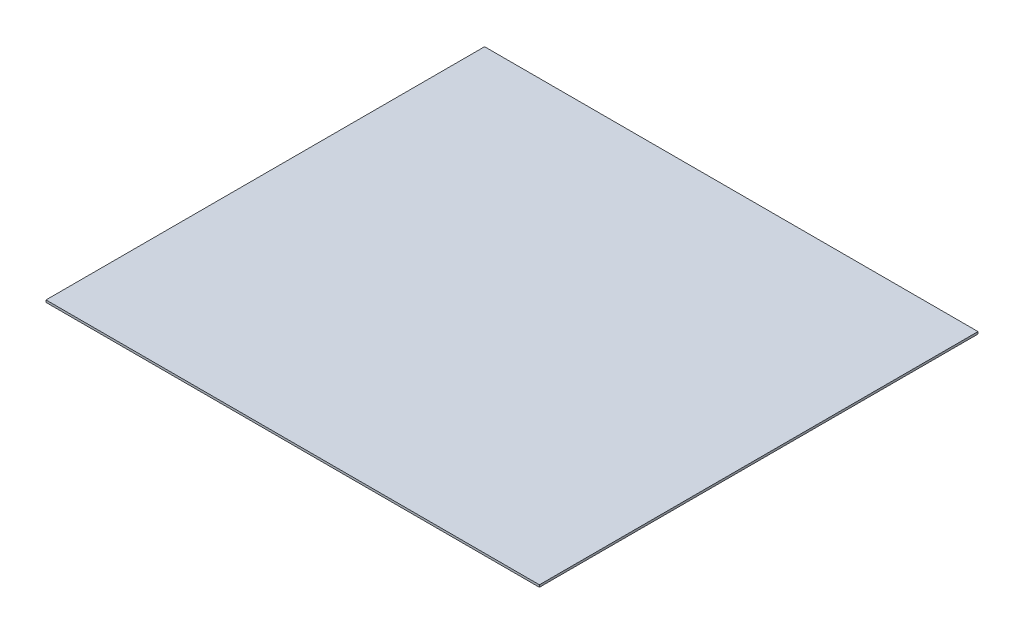
ISO-10303-21;
HEADER;
FILE_DESCRIPTION(('STEP AP214'),'2;1');
FILE_NAME('part.step','',(''),(''),'','','');
FILE_SCHEMA(('AUTOMOTIVE_DESIGN { 1 0 10303 214 1 1 1 1 }'));
ENDSEC;
DATA;
#1=APPLICATION_CONTEXT('core data for automotive mechanical design processes');
#2=APPLICATION_PROTOCOL_DEFINITION('international standard','automotive_design',2000,#1);
#3=PRODUCT_CONTEXT('',#1,'mechanical');
#4=PRODUCT('Part','Part','',(#3));
#5=PRODUCT_RELATED_PRODUCT_CATEGORY('part','',(#4));
#6=PRODUCT_DEFINITION_FORMATION('','',#4);
#7=PRODUCT_DEFINITION_CONTEXT('part definition',#1,'design');
#8=PRODUCT_DEFINITION('design','',#6,#7);
#9=PRODUCT_DEFINITION_SHAPE('','',#8);
#10=(LENGTH_UNIT() NAMED_UNIT(*) SI_UNIT(.MILLI.,.METRE.));
#11=(NAMED_UNIT(*) PLANE_ANGLE_UNIT() SI_UNIT($,.RADIAN.));
#12=(NAMED_UNIT(*) SI_UNIT($,.STERADIAN.) SOLID_ANGLE_UNIT());
#13=UNCERTAINTY_MEASURE_WITH_UNIT(LENGTH_MEASURE(1.E-05),#10,'distance_accuracy_value','');
#14=(GEOMETRIC_REPRESENTATION_CONTEXT(3) GLOBAL_UNCERTAINTY_ASSIGNED_CONTEXT((#13)) GLOBAL_UNIT_ASSIGNED_CONTEXT((#10,
#11,#12)) REPRESENTATION_CONTEXT('',''));
#15=CARTESIAN_POINT('',(0.,0.,0.));
#16=DIRECTION('',(0.,0.,1.));
#17=DIRECTION('',(1.,0.,0.));
#18=AXIS2_PLACEMENT_3D('',#15,#16,#17);
#19=CARTESIAN_POINT('',(225.,-48.000000076,-200.));
#20=DIRECTION('',(-1.,0.,0.));
#21=DIRECTION('',(0.,0.,1.));
#22=AXIS2_PLACEMENT_3D('',#19,#20,#21);
#23=PLANE('',#22);
#24=DIRECTION('',(0.,0.,-1.));
#25=VECTOR('',#24,1.);
#26=CARTESIAN_POINT('',(225.,-50.000000076,-200.));
#27=LINE('',#26,#25);
#28=CARTESIAN_POINT('',(225.,-50.000000076,200.));
#29=VERTEX_POINT('',#28);
#30=CARTESIAN_POINT('',(225.,-50.000000076,-200.));
#31=VERTEX_POINT('',#30);
#32=EDGE_CURVE('E113',#29,#31,#27,.T.);
#33=ORIENTED_EDGE('',*,*,#32,.T.);
#34=DIRECTION('',(0.,-1.,0.));
#35=VECTOR('',#34,1.);
#36=CARTESIAN_POINT('',(225.,-48.000000076,-200.));
#37=LINE('',#36,#35);
#38=CARTESIAN_POINT('',(225.,-48.000000076,-200.));
#39=VERTEX_POINT('',#38);
#40=EDGE_CURVE('E11',#39,#31,#37,.T.);
#41=ORIENTED_EDGE('',*,*,#40,.F.);
#42=DIRECTION('',(0.,0.,-1.));
#43=VECTOR('',#42,1.);
#44=CARTESIAN_POINT('',(225.,-48.000000076,-200.));
#45=LINE('',#44,#43);
#46=CARTESIAN_POINT('',(225.,-48.000000076,200.));
#47=VERTEX_POINT('',#46);
#48=EDGE_CURVE('E97',#47,#39,#45,.T.);
#49=ORIENTED_EDGE('',*,*,#48,.F.);
#50=DIRECTION('',(0.,-1.,0.));
#51=VECTOR('',#50,1.);
#52=CARTESIAN_POINT('',(225.,-48.000000076,200.));
#53=LINE('',#52,#51);
#54=EDGE_CURVE('E109',#47,#29,#53,.T.);
#55=ORIENTED_EDGE('',*,*,#54,.T.);
#56=EDGE_LOOP('',(#33,#41,#49,#55));
#57=FACE_BOUND('',#56,.T.);
#58=ADVANCED_FACE('F45',(#57),#23,.F.);
#59=CARTESIAN_POINT('',(-225.,-48.000000076,-200.));
#60=DIRECTION('',(0.,0.,1.));
#61=DIRECTION('',(1.,0.,0.));
#62=AXIS2_PLACEMENT_3D('',#59,#60,#61);
#63=PLANE('',#62);
#64=DIRECTION('',(-1.,0.,0.));
#65=VECTOR('',#64,1.);
#66=CARTESIAN_POINT('',(-225.,-50.000000076,-200.));
#67=LINE('',#66,#65);
#68=CARTESIAN_POINT('',(-225.,-50.000000076,-200.));
#69=VERTEX_POINT('',#68);
#70=EDGE_CURVE('E102',#31,#69,#67,.T.);
#71=ORIENTED_EDGE('',*,*,#70,.T.);
#72=DIRECTION('',(0.,-1.,0.));
#73=VECTOR('',#72,1.);
#74=CARTESIAN_POINT('',(-225.,-48.000000076,-200.));
#75=LINE('',#74,#73);
#76=CARTESIAN_POINT('',(-225.,-48.000000076,-200.));
#77=VERTEX_POINT('',#76);
#78=EDGE_CURVE('E54',#77,#69,#75,.T.);
#79=ORIENTED_EDGE('',*,*,#78,.F.);
#80=DIRECTION('',(-1.,0.,0.));
#81=VECTOR('',#80,1.);
#82=CARTESIAN_POINT('',(-225.,-48.000000076,-200.));
#83=LINE('',#82,#81);
#84=EDGE_CURVE('E92',#39,#77,#83,.T.);
#85=ORIENTED_EDGE('',*,*,#84,.F.);
#86=ORIENTED_EDGE('',*,*,#40,.T.);
#87=EDGE_LOOP('',(#71,#79,#85,#86));
#88=FACE_BOUND('',#87,.T.);
#89=ADVANCED_FACE('F101',(#88),#63,.F.);
#90=CARTESIAN_POINT('',(-225.,-48.000000076,-200.));
#91=DIRECTION('',(1.,0.,0.));
#92=DIRECTION('',(0.,0.,-1.));
#93=AXIS2_PLACEMENT_3D('',#90,#91,#92);
#94=PLANE('',#93);
#95=DIRECTION('',(0.,0.,1.));
#96=VECTOR('',#95,1.);
#97=CARTESIAN_POINT('',(-225.,-50.000000076,-200.));
#98=LINE('',#97,#96);
#99=CARTESIAN_POINT('',(-225.,-50.000000076,200.));
#100=VERTEX_POINT('',#99);
#101=EDGE_CURVE('E79',#69,#100,#98,.T.);
#102=ORIENTED_EDGE('',*,*,#101,.T.);
#103=DIRECTION('',(0.,-1.,0.));
#104=VECTOR('',#103,1.);
#105=CARTESIAN_POINT('',(-225.,-48.000000076,200.));
#106=LINE('',#105,#104);
#107=CARTESIAN_POINT('',(-225.,-48.000000076,200.));
#108=VERTEX_POINT('',#107);
#109=EDGE_CURVE('E104',#108,#100,#106,.T.);
#110=ORIENTED_EDGE('',*,*,#109,.F.);
#111=DIRECTION('',(0.,0.,1.));
#112=VECTOR('',#111,1.);
#113=CARTESIAN_POINT('',(-225.,-48.000000076,-200.));
#114=LINE('',#113,#112);
#115=EDGE_CURVE('E95',#77,#108,#114,.T.);
#116=ORIENTED_EDGE('',*,*,#115,.F.);
#117=ORIENTED_EDGE('',*,*,#78,.T.);
#118=EDGE_LOOP('',(#102,#110,#116,#117));
#119=FACE_BOUND('',#118,.T.);
#120=ADVANCED_FACE('F105',(#119),#94,.F.);
#121=CARTESIAN_POINT('',(-225.,-48.000000076,200.));
#122=DIRECTION('',(0.,0.,-1.));
#123=DIRECTION('',(-1.,0.,0.));
#124=AXIS2_PLACEMENT_3D('',#121,#122,#123);
#125=PLANE('',#124);
#126=DIRECTION('',(1.,0.,0.));
#127=VECTOR('',#126,1.);
#128=CARTESIAN_POINT('',(-225.,-50.000000076,200.));
#129=LINE('',#128,#127);
#130=EDGE_CURVE('E85',#100,#29,#129,.T.);
#131=ORIENTED_EDGE('',*,*,#130,.T.);
#132=ORIENTED_EDGE('',*,*,#54,.F.);
#133=DIRECTION('',(1.,0.,0.));
#134=VECTOR('',#133,1.);
#135=CARTESIAN_POINT('',(-225.,-48.000000076,200.));
#136=LINE('',#135,#134);
#137=EDGE_CURVE('E62',#108,#47,#136,.T.);
#138=ORIENTED_EDGE('',*,*,#137,.F.);
#139=ORIENTED_EDGE('',*,*,#109,.T.);
#140=EDGE_LOOP('',(#131,#132,#138,#139));
#141=FACE_BOUND('',#140,.T.);
#142=ADVANCED_FACE('F126',(#141),#125,.F.);
#143=CARTESIAN_POINT('',(0.,-48.000000076,0.));
#144=DIRECTION('',(0.,1.,0.));
#145=DIRECTION('',(0.,0.,1.));
#146=AXIS2_PLACEMENT_3D('',#143,#144,#145);
#147=PLANE('',#146);
#148=ORIENTED_EDGE('',*,*,#48,.T.);
#149=ORIENTED_EDGE('',*,*,#84,.T.);
#150=ORIENTED_EDGE('',*,*,#115,.T.);
#151=ORIENTED_EDGE('',*,*,#137,.T.);
#152=EDGE_LOOP('',(#148,#149,#150,#151));
#153=FACE_BOUND('',#152,.T.);
#154=ADVANCED_FACE('F93',(#153),#147,.T.);
#155=CARTESIAN_POINT('',(0.,-50.000000076,0.));
#156=DIRECTION('',(0.,1.,0.));
#157=DIRECTION('',(0.,0.,1.));
#158=AXIS2_PLACEMENT_3D('',#155,#156,#157);
#159=PLANE('',#158);
#160=ORIENTED_EDGE('',*,*,#32,.F.);
#161=ORIENTED_EDGE('',*,*,#130,.F.);
#162=ORIENTED_EDGE('',*,*,#101,.F.);
#163=ORIENTED_EDGE('',*,*,#70,.F.);
#164=EDGE_LOOP('',(#160,#161,#162,#163));
#165=FACE_BOUND('',#164,.T.);
#166=ADVANCED_FACE('F129',(#165),#159,.F.);
#167=CLOSED_SHELL('',(#58,#89,#120,#142,#154,#166));
#168=MANIFOLD_SOLID_BREP('B2',#167);
#169=ADVANCED_BREP_SHAPE_REPRESENTATION('',(#18,#168),#14);
#170=SHAPE_DEFINITION_REPRESENTATION(#9,#169);
ENDSEC;
END-ISO-10303-21;
